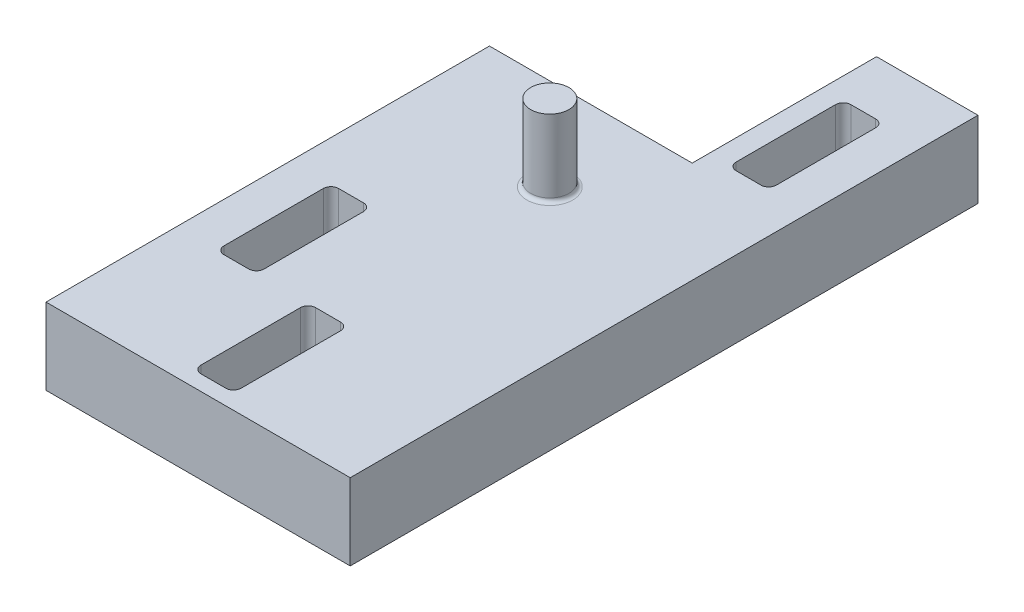
ISO-10303-21;
HEADER;
FILE_DESCRIPTION(('STEP AP214'),'2;1');
FILE_NAME('part.step','',(''),(''),'','','');
FILE_SCHEMA(('AUTOMOTIVE_DESIGN { 1 0 10303 214 1 1 1 1 }'));
ENDSEC;
DATA;
#1=APPLICATION_CONTEXT('core data for automotive mechanical design processes');
#2=APPLICATION_PROTOCOL_DEFINITION('international standard','automotive_design',2000,#1);
#3=PRODUCT_CONTEXT('',#1,'mechanical');
#4=PRODUCT('Part','Part','',(#3));
#5=PRODUCT_RELATED_PRODUCT_CATEGORY('part','',(#4));
#6=PRODUCT_DEFINITION_FORMATION('','',#4);
#7=PRODUCT_DEFINITION_CONTEXT('part definition',#1,'design');
#8=PRODUCT_DEFINITION('design','',#6,#7);
#9=PRODUCT_DEFINITION_SHAPE('','',#8);
#10=(LENGTH_UNIT() NAMED_UNIT(*) SI_UNIT(.MILLI.,.METRE.));
#11=(NAMED_UNIT(*) PLANE_ANGLE_UNIT() SI_UNIT($,.RADIAN.));
#12=(NAMED_UNIT(*) SI_UNIT($,.STERADIAN.) SOLID_ANGLE_UNIT());
#13=UNCERTAINTY_MEASURE_WITH_UNIT(LENGTH_MEASURE(1.E-05),#10,'distance_accuracy_value','');
#14=(GEOMETRIC_REPRESENTATION_CONTEXT(3) GLOBAL_UNCERTAINTY_ASSIGNED_CONTEXT((#13)) GLOBAL_UNIT_ASSIGNED_CONTEXT((#10,
#11,#12)) REPRESENTATION_CONTEXT('',''));
#15=CARTESIAN_POINT('',(0.,0.,0.));
#16=DIRECTION('',(0.,0.,1.));
#17=DIRECTION('',(1.,0.,0.));
#18=AXIS2_PLACEMENT_3D('',#15,#16,#17);
#19=CARTESIAN_POINT('',(0.,10.,0.));
#20=DIRECTION('',(0.,-1.,0.));
#21=DIRECTION('',(0.,0.,-1.));
#22=AXIS2_PLACEMENT_3D('',#19,#20,#21);
#23=PLANE('',#22);
#24=DIRECTION('',(0.,0.,1.));
#25=VECTOR('',#24,1.);
#26=CARTESIAN_POINT('',(-14.625,10.,-17.5));
#27=LINE('',#26,#25);
#28=CARTESIAN_POINT('',(-14.625,10.,-16.5));
#29=VERTEX_POINT('',#28);
#30=CARTESIAN_POINT('',(-14.625,10.,-3.5));
#31=VERTEX_POINT('',#30);
#32=EDGE_CURVE('E551',#29,#31,#27,.T.);
#33=ORIENTED_EDGE('',*,*,#32,.F.);
#34=CARTESIAN_POINT('',(-13.6250000000001,10.,-16.5));
#35=DIRECTION('',(0.,-1.,0.));
#36=DIRECTION('',(0.,0.,-1.));
#37=AXIS2_PLACEMENT_3D('',#34,#35,#36);
#38=CIRCLE('',#37,1.);
#39=CARTESIAN_POINT('',(-13.6250000000001,10.,-17.5));
#40=VERTEX_POINT('',#39);
#41=EDGE_CURVE('E68',#29,#40,#38,.T.);
#42=ORIENTED_EDGE('',*,*,#41,.T.);
#43=DIRECTION('',(-1.,0.,0.));
#44=VECTOR('',#43,1.);
#45=CARTESIAN_POINT('',(-12.,10.,-17.5));
#46=LINE('',#45,#44);
#47=CARTESIAN_POINT('',(-10.375,10.,-17.5));
#48=VERTEX_POINT('',#47);
#49=EDGE_CURVE('E279',#48,#40,#46,.T.);
#50=ORIENTED_EDGE('',*,*,#49,.F.);
#51=CARTESIAN_POINT('',(-10.375,10.,-16.5));
#52=DIRECTION('',(0.,-1.,0.));
#53=DIRECTION('',(0.,0.,-1.));
#54=AXIS2_PLACEMENT_3D('',#51,#52,#53);
#55=CIRCLE('',#54,1.);
#56=CARTESIAN_POINT('',(-9.37500000000007,10.,-16.5));
#57=VERTEX_POINT('',#56);
#58=EDGE_CURVE('E432',#48,#57,#55,.T.);
#59=ORIENTED_EDGE('',*,*,#58,.T.);
#60=DIRECTION('',(0.,0.,-1.));
#61=VECTOR('',#60,1.);
#62=CARTESIAN_POINT('',(-9.37500000000007,10.,-2.5));
#63=LINE('',#62,#61);
#64=CARTESIAN_POINT('',(-9.37500000000007,10.,-3.5));
#65=VERTEX_POINT('',#64);
#66=EDGE_CURVE('E284',#65,#57,#63,.T.);
#67=ORIENTED_EDGE('',*,*,#66,.F.);
#68=CARTESIAN_POINT('',(-10.375,10.,-3.5));
#69=DIRECTION('',(0.,-1.,0.));
#70=DIRECTION('',(0.,0.,-1.));
#71=AXIS2_PLACEMENT_3D('',#68,#69,#70);
#72=CIRCLE('',#71,1.);
#73=CARTESIAN_POINT('',(-10.375,10.,-2.5));
#74=VERTEX_POINT('',#73);
#75=EDGE_CURVE('E428',#65,#74,#72,.T.);
#76=ORIENTED_EDGE('',*,*,#75,.T.);
#77=DIRECTION('',(1.,0.,0.));
#78=VECTOR('',#77,1.);
#79=CARTESIAN_POINT('',(-12.0000000000001,10.,-2.5));
#80=LINE('',#79,#78);
#81=CARTESIAN_POINT('',(-13.6250000000001,10.,-2.5));
#82=VERTEX_POINT('',#81);
#83=EDGE_CURVE('E555',#82,#74,#80,.T.);
#84=ORIENTED_EDGE('',*,*,#83,.F.);
#85=CARTESIAN_POINT('',(-13.6250000000001,10.,-3.5));
#86=DIRECTION('',(0.,-1.,0.));
#87=DIRECTION('',(0.,0.,-1.));
#88=AXIS2_PLACEMENT_3D('',#85,#86,#87);
#89=CIRCLE('',#88,1.);
#90=EDGE_CURVE('E424',#82,#31,#89,.T.);
#91=ORIENTED_EDGE('',*,*,#90,.T.);
#92=EDGE_LOOP('',(#33,#42,#50,#59,#67,#76,#84,#91));
#93=FACE_BOUND('',#92,.T.);
#94=DIRECTION('',(-1.,0.,0.));
#95=VECTOR('',#94,1.);
#96=CARTESIAN_POINT('',(0.,10.,-2.5));
#97=LINE('',#96,#95);
#98=CARTESIAN_POINT('',(1.625,10.,-2.5));
#99=VERTEX_POINT('',#98);
#100=CARTESIAN_POINT('',(-1.62500000000005,10.,-2.5));
#101=VERTEX_POINT('',#100);
#102=EDGE_CURVE('E292',#99,#101,#97,.T.);
#103=ORIENTED_EDGE('',*,*,#102,.F.);
#104=CARTESIAN_POINT('',(1.625,10.,-1.5));
#105=DIRECTION('',(0.,-1.,0.));
#106=DIRECTION('',(0.,0.,-1.));
#107=AXIS2_PLACEMENT_3D('',#104,#105,#106);
#108=CIRCLE('',#107,1.);
#109=CARTESIAN_POINT('',(2.62500000000006,10.,-1.5));
#110=VERTEX_POINT('',#109);
#111=EDGE_CURVE('E354',#99,#110,#108,.T.);
#112=ORIENTED_EDGE('',*,*,#111,.T.);
#113=DIRECTION('',(0.,0.,-1.));
#114=VECTOR('',#113,1.);
#115=CARTESIAN_POINT('',(2.62500000000003,10.,12.5));
#116=LINE('',#115,#114);
#117=CARTESIAN_POINT('',(2.62500000000004,10.,11.5));
#118=VERTEX_POINT('',#117);
#119=EDGE_CURVE('E287',#118,#110,#116,.T.);
#120=ORIENTED_EDGE('',*,*,#119,.F.);
#121=CARTESIAN_POINT('',(1.62499999999998,10.,11.5));
#122=DIRECTION('',(0.,-1.,0.));
#123=DIRECTION('',(0.,0.,-1.));
#124=AXIS2_PLACEMENT_3D('',#121,#122,#123);
#125=CIRCLE('',#124,1.);
#126=CARTESIAN_POINT('',(1.62499999999998,10.,12.5));
#127=VERTEX_POINT('',#126);
#128=EDGE_CURVE('E350',#118,#127,#125,.T.);
#129=ORIENTED_EDGE('',*,*,#128,.T.);
#130=DIRECTION('',(-1.,0.,0.));
#131=VECTOR('',#130,1.);
#132=CARTESIAN_POINT('',(0.,10.,12.5));
#133=LINE('',#132,#131);
#134=CARTESIAN_POINT('',(-1.62500000000006,10.,12.5));
#135=VERTEX_POINT('',#134);
#136=EDGE_CURVE('E298',#127,#135,#133,.T.);
#137=ORIENTED_EDGE('',*,*,#136,.T.);
#138=CARTESIAN_POINT('',(-1.62500000000006,10.,11.5));
#139=DIRECTION('',(0.,-1.,0.));
#140=DIRECTION('',(0.,0.,-1.));
#141=AXIS2_PLACEMENT_3D('',#138,#139,#140);
#142=CIRCLE('',#141,1.);
#143=CARTESIAN_POINT('',(-2.625,10.,11.5));
#144=VERTEX_POINT('',#143);
#145=EDGE_CURVE('E331',#135,#144,#142,.T.);
#146=ORIENTED_EDGE('',*,*,#145,.T.);
#147=DIRECTION('',(0.,0.,1.));
#148=VECTOR('',#147,1.);
#149=CARTESIAN_POINT('',(-2.625,10.,-2.5));
#150=LINE('',#149,#148);
#151=CARTESIAN_POINT('',(-2.625,10.,-1.5));
#152=VERTEX_POINT('',#151);
#153=EDGE_CURVE('E294',#152,#144,#150,.T.);
#154=ORIENTED_EDGE('',*,*,#153,.F.);
#155=CARTESIAN_POINT('',(-1.62500000000005,10.,-1.5));
#156=DIRECTION('',(0.,-1.,0.));
#157=DIRECTION('',(0.,0.,-1.));
#158=AXIS2_PLACEMENT_3D('',#155,#156,#157);
#159=CIRCLE('',#158,1.);
#160=EDGE_CURVE('E335',#152,#101,#159,.T.);
#161=ORIENTED_EDGE('',*,*,#160,.T.);
#162=EDGE_LOOP('',(#103,#112,#120,#129,#137,#146,#154,#161));
#163=FACE_BOUND('',#162,.T.);
#164=DIRECTION('',(-1.,0.,0.));
#165=VECTOR('',#164,1.);
#166=CARTESIAN_POINT('',(11.9999999999999,10.,-60.5));
#167=LINE('',#166,#165);
#168=CARTESIAN_POINT('',(13.6249999999999,10.,-60.5));
#169=VERTEX_POINT('',#168);
#170=CARTESIAN_POINT('',(10.375,10.,-60.5));
#171=VERTEX_POINT('',#170);
#172=EDGE_CURVE('E564',#169,#171,#167,.T.);
#173=ORIENTED_EDGE('',*,*,#172,.F.);
#174=CARTESIAN_POINT('',(13.6249999999999,10.,-59.5));
#175=DIRECTION('',(0.,-1.,0.));
#176=DIRECTION('',(0.,0.,-1.));
#177=AXIS2_PLACEMENT_3D('',#174,#175,#176);
#178=CIRCLE('',#177,1.);
#179=CARTESIAN_POINT('',(14.6249999999999,10.,-59.5));
#180=VERTEX_POINT('',#179);
#181=EDGE_CURVE('E420',#169,#180,#178,.T.);
#182=ORIENTED_EDGE('',*,*,#181,.T.);
#183=DIRECTION('',(0.,0.,-1.));
#184=VECTOR('',#183,1.);
#185=CARTESIAN_POINT('',(14.6249999999999,10.,-60.5));
#186=LINE('',#185,#184);
#187=CARTESIAN_POINT('',(14.6249999999999,10.,-46.5));
#188=VERTEX_POINT('',#187);
#189=EDGE_CURVE('E561',#188,#180,#186,.T.);
#190=ORIENTED_EDGE('',*,*,#189,.F.);
#191=CARTESIAN_POINT('',(13.625,10.,-46.5));
#192=DIRECTION('',(0.,-1.,0.));
#193=DIRECTION('',(0.,0.,-1.));
#194=AXIS2_PLACEMENT_3D('',#191,#192,#193);
#195=CIRCLE('',#194,1.);
#196=CARTESIAN_POINT('',(13.625,10.,-45.5));
#197=VERTEX_POINT('',#196);
#198=EDGE_CURVE('E409',#188,#197,#195,.T.);
#199=ORIENTED_EDGE('',*,*,#198,.T.);
#200=DIRECTION('',(1.,0.,0.));
#201=VECTOR('',#200,1.);
#202=CARTESIAN_POINT('',(12.,10.,-45.5));
#203=LINE('',#202,#201);
#204=CARTESIAN_POINT('',(10.375,10.,-45.5));
#205=VERTEX_POINT('',#204);
#206=EDGE_CURVE('E573',#205,#197,#203,.T.);
#207=ORIENTED_EDGE('',*,*,#206,.F.);
#208=CARTESIAN_POINT('',(10.375,10.,-46.5));
#209=DIRECTION('',(0.,-1.,0.));
#210=DIRECTION('',(0.,0.,-1.));
#211=AXIS2_PLACEMENT_3D('',#208,#209,#210);
#212=CIRCLE('',#211,1.);
#213=CARTESIAN_POINT('',(9.37499999999995,10.,-46.5));
#214=VERTEX_POINT('',#213);
#215=EDGE_CURVE('E405',#205,#214,#212,.T.);
#216=ORIENTED_EDGE('',*,*,#215,.T.);
#217=DIRECTION('',(0.,0.,1.));
#218=VECTOR('',#217,1.);
#219=CARTESIAN_POINT('',(9.37499999999995,10.,-60.5));
#220=LINE('',#219,#218);
#221=CARTESIAN_POINT('',(9.37499999999995,10.,-59.5));
#222=VERTEX_POINT('',#221);
#223=EDGE_CURVE('E569',#222,#214,#220,.T.);
#224=ORIENTED_EDGE('',*,*,#223,.F.);
#225=CARTESIAN_POINT('',(10.375,10.,-59.5));
#226=DIRECTION('',(0.,-1.,0.));
#227=DIRECTION('',(0.,0.,-1.));
#228=AXIS2_PLACEMENT_3D('',#225,#226,#227);
#229=CIRCLE('',#228,1.);
#230=EDGE_CURVE('E414',#222,#171,#229,.T.);
#231=ORIENTED_EDGE('',*,*,#230,.T.);
#232=EDGE_LOOP('',(#173,#182,#190,#199,#207,#216,#224,#231));
#233=FACE_BOUND('',#232,.T.);
#234=CARTESIAN_POINT('',(0.,10.,-31.5));
#235=DIRECTION('',(0.,-1.,0.));
#236=DIRECTION('',(0.,0.,-1.));
#237=AXIS2_PLACEMENT_3D('',#234,#235,#236);
#238=CIRCLE('',#237,3.);
#239=CARTESIAN_POINT('',(0.,10.,-34.5));
#240=VERTEX_POINT('',#239);
#241=EDGE_CURVE('E11',#240,#240,#238,.T.);
#242=ORIENTED_EDGE('',*,*,#241,.T.);
#243=EDGE_LOOP('',(#242));
#244=FACE_BOUND('',#243,.T.);
#245=DIRECTION('',(-1.,0.,0.));
#246=VECTOR('',#245,1.);
#247=CARTESIAN_POINT('',(19.8937990848774,10.,-67.6091923824634));
#248=LINE('',#247,#246);
#249=CARTESIAN_POINT('',(19.8937990848774,10.,-67.6091923824634));
#250=VERTEX_POINT('',#249);
#251=CARTESIAN_POINT('',(6.62379908487737,10.,-67.6091923824634));
#252=VERTEX_POINT('',#251);
#253=EDGE_CURVE('E60',#250,#252,#248,.T.);
#254=ORIENTED_EDGE('',*,*,#253,.T.);
#255=DIRECTION('',(0.,0.,1.));
#256=VECTOR('',#255,1.);
#257=CARTESIAN_POINT('',(6.62379908487737,10.,-67.6091923824634));
#258=LINE('',#257,#256);
#259=CARTESIAN_POINT('',(6.62379908487737,10.,-43.5000000000001));
#260=VERTEX_POINT('',#259);
#261=EDGE_CURVE('E623',#252,#260,#258,.T.);
#262=ORIENTED_EDGE('',*,*,#261,.T.);
#263=DIRECTION('',(-1.,0.,0.));
#264=VECTOR('',#263,1.);
#265=CARTESIAN_POINT('',(-6.62499999999949,10.,-43.5000000000001));
#266=LINE('',#265,#264);
#267=CARTESIAN_POINT('',(-19.8937990848772,10.,-43.5000000000001));
#268=VERTEX_POINT('',#267);
#269=EDGE_CURVE('E272',#260,#268,#266,.T.);
#270=ORIENTED_EDGE('',*,*,#269,.T.);
#271=DIRECTION('',(0.,0.,1.));
#272=VECTOR('',#271,1.);
#273=CARTESIAN_POINT('',(-19.8937990848772,10.,-77.5));
#274=LINE('',#273,#272);
#275=CARTESIAN_POINT('',(-19.8937990848772,10.,14.5));
#276=VERTEX_POINT('',#275);
#277=EDGE_CURVE('E303',#268,#276,#274,.T.);
#278=ORIENTED_EDGE('',*,*,#277,.T.);
#279=DIRECTION('',(1.,0.,0.));
#280=VECTOR('',#279,1.);
#281=CARTESIAN_POINT('',(-19.8937990848772,10.,14.5));
#282=LINE('',#281,#280);
#283=CARTESIAN_POINT('',(19.8937990848772,10.,14.5));
#284=VERTEX_POINT('',#283);
#285=EDGE_CURVE('E300',#276,#284,#282,.T.);
#286=ORIENTED_EDGE('',*,*,#285,.T.);
#287=DIRECTION('',(0.,0.,1.));
#288=VECTOR('',#287,1.);
#289=CARTESIAN_POINT('',(19.8937990848774,10.,-77.5));
#290=LINE('',#289,#288);
#291=EDGE_CURVE('E282',#250,#284,#290,.T.);
#292=ORIENTED_EDGE('',*,*,#291,.F.);
#293=EDGE_LOOP('',(#254,#262,#270,#278,#286,#292));
#294=FACE_BOUND('',#293,.T.);
#295=ADVANCED_FACE('F45',(#93,#163,#233,#244,#294),#23,.F.);
#296=CARTESIAN_POINT('',(0.,0.,0.));
#297=DIRECTION('',(0.,-1.,0.));
#298=DIRECTION('',(0.,0.,-1.));
#299=AXIS2_PLACEMENT_3D('',#296,#297,#298);
#300=PLANE('',#299);
#301=DIRECTION('',(0.,0.,-1.));
#302=VECTOR('',#301,1.);
#303=CARTESIAN_POINT('',(-9.37500000000001,0.,-17.5));
#304=LINE('',#303,#302);
#305=CARTESIAN_POINT('',(-9.37500000000001,0.,-3.5));
#306=VERTEX_POINT('',#305);
#307=CARTESIAN_POINT('',(-9.37500000000001,0.,-16.5));
#308=VERTEX_POINT('',#307);
#309=EDGE_CURVE('E552',#306,#308,#304,.T.);
#310=ORIENTED_EDGE('',*,*,#309,.T.);
#311=CARTESIAN_POINT('',(-10.375,0.,-16.5));
#312=DIRECTION('',(0.,-1.,0.));
#313=DIRECTION('',(0.,0.,-1.));
#314=AXIS2_PLACEMENT_3D('',#311,#312,#313);
#315=CIRCLE('',#314,1.);
#316=CARTESIAN_POINT('',(-10.375,0.,-17.5));
#317=VERTEX_POINT('',#316);
#318=EDGE_CURVE('E430',#308,#317,#315,.F.);
#319=ORIENTED_EDGE('',*,*,#318,.T.);
#320=DIRECTION('',(-1.,0.,0.));
#321=VECTOR('',#320,1.);
#322=CARTESIAN_POINT('',(-12.,0.,-17.5));
#323=LINE('',#322,#321);
#324=CARTESIAN_POINT('',(-13.6250000000001,0.,-17.5));
#325=VERTEX_POINT('',#324);
#326=EDGE_CURVE('E545',#317,#325,#323,.T.);
#327=ORIENTED_EDGE('',*,*,#326,.T.);
#328=CARTESIAN_POINT('',(-13.6250000000001,0.,-16.5));
#329=DIRECTION('',(0.,-1.,0.));
#330=DIRECTION('',(0.,0.,-1.));
#331=AXIS2_PLACEMENT_3D('',#328,#329,#330);
#332=CIRCLE('',#331,1.);
#333=CARTESIAN_POINT('',(-14.6250000000001,0.,-16.5));
#334=VERTEX_POINT('',#333);
#335=EDGE_CURVE('E434',#325,#334,#332,.F.);
#336=ORIENTED_EDGE('',*,*,#335,.T.);
#337=DIRECTION('',(0.,0.,1.));
#338=VECTOR('',#337,1.);
#339=CARTESIAN_POINT('',(-14.6250000000001,0.,-2.5));
#340=LINE('',#339,#338);
#341=CARTESIAN_POINT('',(-14.6250000000001,0.,-3.5));
#342=VERTEX_POINT('',#341);
#343=EDGE_CURVE('E576',#334,#342,#340,.T.);
#344=ORIENTED_EDGE('',*,*,#343,.T.);
#345=CARTESIAN_POINT('',(-13.6250000000001,0.,-3.5));
#346=DIRECTION('',(0.,-1.,0.));
#347=DIRECTION('',(0.,0.,-1.));
#348=AXIS2_PLACEMENT_3D('',#345,#346,#347);
#349=CIRCLE('',#348,1.);
#350=CARTESIAN_POINT('',(-13.6250000000001,0.,-2.5));
#351=VERTEX_POINT('',#350);
#352=EDGE_CURVE('E422',#342,#351,#349,.F.);
#353=ORIENTED_EDGE('',*,*,#352,.T.);
#354=DIRECTION('',(1.,0.,0.));
#355=VECTOR('',#354,1.);
#356=CARTESIAN_POINT('',(-12.0000000000001,0.,-2.5));
#357=LINE('',#356,#355);
#358=CARTESIAN_POINT('',(-10.375,0.,-2.5));
#359=VERTEX_POINT('',#358);
#360=EDGE_CURVE('E557',#351,#359,#357,.T.);
#361=ORIENTED_EDGE('',*,*,#360,.T.);
#362=CARTESIAN_POINT('',(-10.375,0.,-3.5));
#363=DIRECTION('',(0.,-1.,0.));
#364=DIRECTION('',(0.,0.,-1.));
#365=AXIS2_PLACEMENT_3D('',#362,#363,#364);
#366=CIRCLE('',#365,1.);
#367=EDGE_CURVE('E426',#359,#306,#366,.F.);
#368=ORIENTED_EDGE('',*,*,#367,.T.);
#369=EDGE_LOOP('',(#310,#319,#327,#336,#344,#353,#361,#368));
#370=FACE_BOUND('',#369,.T.);
#371=DIRECTION('',(1.,0.,0.));
#372=VECTOR('',#371,1.);
#373=CARTESIAN_POINT('',(12.,0.,-45.5));
#374=LINE('',#373,#372);
#375=CARTESIAN_POINT('',(10.375,0.,-45.5));
#376=VERTEX_POINT('',#375);
#377=CARTESIAN_POINT('',(13.625,0.,-45.5));
#378=VERTEX_POINT('',#377);
#379=EDGE_CURVE('E585',#376,#378,#374,.T.);
#380=ORIENTED_EDGE('',*,*,#379,.T.);
#381=CARTESIAN_POINT('',(13.625,0.,-46.5));
#382=DIRECTION('',(0.,-1.,0.));
#383=DIRECTION('',(0.,0.,-1.));
#384=AXIS2_PLACEMENT_3D('',#381,#382,#383);
#385=CIRCLE('',#384,1.);
#386=CARTESIAN_POINT('',(14.625,0.,-46.5));
#387=VERTEX_POINT('',#386);
#388=EDGE_CURVE('E407',#378,#387,#385,.F.);
#389=ORIENTED_EDGE('',*,*,#388,.T.);
#390=DIRECTION('',(0.,0.,-1.));
#391=VECTOR('',#390,1.);
#392=CARTESIAN_POINT('',(14.6249999999999,0.,-58.));
#393=LINE('',#392,#391);
#394=CARTESIAN_POINT('',(14.6249999999999,0.,-59.5));
#395=VERTEX_POINT('',#394);
#396=EDGE_CURVE('E565',#387,#395,#393,.T.);
#397=ORIENTED_EDGE('',*,*,#396,.T.);
#398=CARTESIAN_POINT('',(13.6249999999999,0.,-59.5));
#399=DIRECTION('',(0.,-1.,0.));
#400=DIRECTION('',(0.,0.,-1.));
#401=AXIS2_PLACEMENT_3D('',#398,#399,#400);
#402=CIRCLE('',#401,1.);
#403=CARTESIAN_POINT('',(13.6249999999999,0.,-60.5));
#404=VERTEX_POINT('',#403);
#405=EDGE_CURVE('E417',#395,#404,#402,.F.);
#406=ORIENTED_EDGE('',*,*,#405,.T.);
#407=DIRECTION('',(-1.,0.,0.));
#408=VECTOR('',#407,1.);
#409=CARTESIAN_POINT('',(11.9999999999999,0.,-60.5));
#410=LINE('',#409,#408);
#411=CARTESIAN_POINT('',(10.375,0.,-60.5));
#412=VERTEX_POINT('',#411);
#413=EDGE_CURVE('E577',#404,#412,#410,.T.);
#414=ORIENTED_EDGE('',*,*,#413,.T.);
#415=CARTESIAN_POINT('',(10.375,0.,-59.5));
#416=DIRECTION('',(0.,-1.,0.));
#417=DIRECTION('',(0.,0.,-1.));
#418=AXIS2_PLACEMENT_3D('',#415,#416,#417);
#419=CIRCLE('',#418,1.);
#420=CARTESIAN_POINT('',(9.37500000000001,0.,-59.5));
#421=VERTEX_POINT('',#420);
#422=EDGE_CURVE('E411',#412,#421,#419,.F.);
#423=ORIENTED_EDGE('',*,*,#422,.T.);
#424=DIRECTION('',(0.,0.,1.));
#425=VECTOR('',#424,1.);
#426=CARTESIAN_POINT('',(9.37500000000001,0.,-45.5));
#427=LINE('',#426,#425);
#428=CARTESIAN_POINT('',(9.37500000000001,0.,-46.5));
#429=VERTEX_POINT('',#428);
#430=EDGE_CURVE('E581',#421,#429,#427,.T.);
#431=ORIENTED_EDGE('',*,*,#430,.T.);
#432=CARTESIAN_POINT('',(10.375,0.,-46.5));
#433=DIRECTION('',(0.,-1.,0.));
#434=DIRECTION('',(0.,0.,-1.));
#435=AXIS2_PLACEMENT_3D('',#432,#433,#434);
#436=CIRCLE('',#435,1.);
#437=EDGE_CURVE('E402',#429,#376,#436,.F.);
#438=ORIENTED_EDGE('',*,*,#437,.T.);
#439=EDGE_LOOP('',(#380,#389,#397,#406,#414,#423,#431,#438));
#440=FACE_BOUND('',#439,.T.);
#441=DIRECTION('',(0.,0.,1.));
#442=VECTOR('',#441,1.);
#443=CARTESIAN_POINT('',(2.625,0.,-2.5));
#444=LINE('',#443,#442);
#445=CARTESIAN_POINT('',(2.625,0.,-1.5));
#446=VERTEX_POINT('',#445);
#447=CARTESIAN_POINT('',(2.62499999999998,0.,11.5));
#448=VERTEX_POINT('',#447);
#449=EDGE_CURVE('E278',#446,#448,#444,.T.);
#450=ORIENTED_EDGE('',*,*,#449,.F.);
#451=CARTESIAN_POINT('',(1.625,0.,-1.5));
#452=DIRECTION('',(0.,-1.,0.));
#453=DIRECTION('',(0.,0.,-1.));
#454=AXIS2_PLACEMENT_3D('',#451,#452,#453);
#455=CIRCLE('',#454,1.);
#456=CARTESIAN_POINT('',(1.625,0.,-2.5));
#457=VERTEX_POINT('',#456);
#458=EDGE_CURVE('E352',#446,#457,#455,.F.);
#459=ORIENTED_EDGE('',*,*,#458,.T.);
#460=DIRECTION('',(-1.,0.,0.));
#461=VECTOR('',#460,1.);
#462=CARTESIAN_POINT('',(0.,0.,-2.5));
#463=LINE('',#462,#461);
#464=CARTESIAN_POINT('',(-1.62500000000005,0.,-2.5));
#465=VERTEX_POINT('',#464);
#466=EDGE_CURVE('E291',#457,#465,#463,.T.);
#467=ORIENTED_EDGE('',*,*,#466,.T.);
#468=CARTESIAN_POINT('',(-1.62500000000005,0.,-1.5));
#469=DIRECTION('',(0.,-1.,0.));
#470=DIRECTION('',(0.,0.,-1.));
#471=AXIS2_PLACEMENT_3D('',#468,#469,#470);
#472=CIRCLE('',#471,1.);
#473=CARTESIAN_POINT('',(-2.62500000000005,0.,-1.5));
#474=VERTEX_POINT('',#473);
#475=EDGE_CURVE('E333',#465,#474,#472,.F.);
#476=ORIENTED_EDGE('',*,*,#475,.T.);
#477=DIRECTION('',(0.,0.,-1.));
#478=VECTOR('',#477,1.);
#479=CARTESIAN_POINT('',(-2.62500000000006,0.,12.5));
#480=LINE('',#479,#478);
#481=CARTESIAN_POINT('',(-2.62500000000006,0.,11.5));
#482=VERTEX_POINT('',#481);
#483=EDGE_CURVE('E307',#482,#474,#480,.T.);
#484=ORIENTED_EDGE('',*,*,#483,.F.);
#485=CARTESIAN_POINT('',(-1.62500000000006,0.,11.5));
#486=DIRECTION('',(0.,-1.,0.));
#487=DIRECTION('',(0.,0.,-1.));
#488=AXIS2_PLACEMENT_3D('',#485,#486,#487);
#489=CIRCLE('',#488,1.);
#490=CARTESIAN_POINT('',(-1.62500000000006,0.,12.5));
#491=VERTEX_POINT('',#490);
#492=EDGE_CURVE('E328',#482,#491,#489,.F.);
#493=ORIENTED_EDGE('',*,*,#492,.T.);
#494=DIRECTION('',(-1.,0.,0.));
#495=VECTOR('',#494,1.);
#496=CARTESIAN_POINT('',(0.,0.,12.5));
#497=LINE('',#496,#495);
#498=CARTESIAN_POINT('',(1.62499999999998,0.,12.5));
#499=VERTEX_POINT('',#498);
#500=EDGE_CURVE('E310',#499,#491,#497,.T.);
#501=ORIENTED_EDGE('',*,*,#500,.F.);
#502=CARTESIAN_POINT('',(1.62499999999998,0.,11.5));
#503=DIRECTION('',(0.,-1.,0.));
#504=DIRECTION('',(0.,0.,-1.));
#505=AXIS2_PLACEMENT_3D('',#502,#503,#504);
#506=CIRCLE('',#505,1.);
#507=EDGE_CURVE('E348',#499,#448,#506,.F.);
#508=ORIENTED_EDGE('',*,*,#507,.T.);
#509=EDGE_LOOP('',(#450,#459,#467,#476,#484,#493,#501,#508));
#510=FACE_BOUND('',#509,.T.);
#511=DIRECTION('',(0.,0.,1.));
#512=VECTOR('',#511,1.);
#513=CARTESIAN_POINT('',(6.62379908487737,0.,-67.6091923824634));
#514=LINE('',#513,#512);
#515=CARTESIAN_POINT('',(6.62379908487737,0.,-67.6091923824634));
#516=VERTEX_POINT('',#515);
#517=CARTESIAN_POINT('',(6.62379908487737,0.,-43.5000000000001));
#518=VERTEX_POINT('',#517);
#519=EDGE_CURVE('E270',#516,#518,#514,.T.);
#520=ORIENTED_EDGE('',*,*,#519,.F.);
#521=DIRECTION('',(-1.,0.,0.));
#522=VECTOR('',#521,1.);
#523=CARTESIAN_POINT('',(19.8937990848774,0.,-67.6091923824634));
#524=LINE('',#523,#522);
#525=CARTESIAN_POINT('',(19.8937990848774,0.,-67.6091923824634));
#526=VERTEX_POINT('',#525);
#527=EDGE_CURVE('E255',#526,#516,#524,.T.);
#528=ORIENTED_EDGE('',*,*,#527,.F.);
#529=DIRECTION('',(0.,0.,1.));
#530=VECTOR('',#529,1.);
#531=CARTESIAN_POINT('',(19.8937990848774,0.,-77.5));
#532=LINE('',#531,#530);
#533=CARTESIAN_POINT('',(19.8937990848772,0.,14.5));
#534=VERTEX_POINT('',#533);
#535=EDGE_CURVE('E267',#526,#534,#532,.T.);
#536=ORIENTED_EDGE('',*,*,#535,.T.);
#537=DIRECTION('',(1.,0.,0.));
#538=VECTOR('',#537,1.);
#539=CARTESIAN_POINT('',(-19.8937990848772,0.,14.5));
#540=LINE('',#539,#538);
#541=CARTESIAN_POINT('',(-19.8937990848772,0.,14.5));
#542=VERTEX_POINT('',#541);
#543=EDGE_CURVE('E312',#542,#534,#540,.T.);
#544=ORIENTED_EDGE('',*,*,#543,.F.);
#545=DIRECTION('',(0.,0.,1.));
#546=VECTOR('',#545,1.);
#547=CARTESIAN_POINT('',(-19.8937990848772,0.,-77.5));
#548=LINE('',#547,#546);
#549=CARTESIAN_POINT('',(-19.8937990848772,0.,-43.5000000000001));
#550=VERTEX_POINT('',#549);
#551=EDGE_CURVE('E295',#550,#542,#548,.T.);
#552=ORIENTED_EDGE('',*,*,#551,.F.);
#553=DIRECTION('',(-1.,0.,0.));
#554=VECTOR('',#553,1.);
#555=CARTESIAN_POINT('',(6.62379908487737,0.,-43.5000000000001));
#556=LINE('',#555,#554);
#557=EDGE_CURVE('E629',#518,#550,#556,.T.);
#558=ORIENTED_EDGE('',*,*,#557,.F.);
#559=EDGE_LOOP('',(#520,#528,#536,#544,#552,#558));
#560=FACE_BOUND('',#559,.T.);
#561=ADVANCED_FACE('F265',(#370,#440,#510,#560),#300,.T.);
#562=CARTESIAN_POINT('',(-19.8937990848772,10.,-77.5));
#563=DIRECTION('',(1.,0.,0.));
#564=DIRECTION('',(0.,0.,-1.));
#565=AXIS2_PLACEMENT_3D('',#562,#563,#564);
#566=PLANE('',#565);
#567=DIRECTION('',(0.,1.,0.));
#568=VECTOR('',#567,1.);
#569=CARTESIAN_POINT('',(-19.8937990848772,0.,-43.5000000000001));
#570=LINE('',#569,#568);
#571=EDGE_CURVE('E633',#550,#268,#570,.T.);
#572=ORIENTED_EDGE('',*,*,#571,.F.);
#573=ORIENTED_EDGE('',*,*,#551,.T.);
#574=DIRECTION('',(0.,-1.,0.));
#575=VECTOR('',#574,1.);
#576=CARTESIAN_POINT('',(-19.8937990848772,10.,14.5));
#577=LINE('',#576,#575);
#578=EDGE_CURVE('E305',#276,#542,#577,.T.);
#579=ORIENTED_EDGE('',*,*,#578,.F.);
#580=ORIENTED_EDGE('',*,*,#277,.F.);
#581=EDGE_LOOP('',(#572,#573,#579,#580));
#582=FACE_BOUND('',#581,.T.);
#583=ADVANCED_FACE('F461',(#582),#566,.F.);
#584=CARTESIAN_POINT('',(19.8937990848774,10.,-77.5));
#585=DIRECTION('',(1.,0.,0.));
#586=DIRECTION('',(0.,0.,-1.));
#587=AXIS2_PLACEMENT_3D('',#584,#585,#586);
#588=PLANE('',#587);
#589=ORIENTED_EDGE('',*,*,#535,.F.);
#590=DIRECTION('',(0.,1.,0.));
#591=VECTOR('',#590,1.);
#592=CARTESIAN_POINT('',(19.8937990848774,0.,-67.6091923824634));
#593=LINE('',#592,#591);
#594=EDGE_CURVE('E252',#526,#250,#593,.T.);
#595=ORIENTED_EDGE('',*,*,#594,.T.);
#596=ORIENTED_EDGE('',*,*,#291,.T.);
#597=DIRECTION('',(0.,-1.,0.));
#598=VECTOR('',#597,1.);
#599=CARTESIAN_POINT('',(19.8937990848772,10.,14.5));
#600=LINE('',#599,#598);
#601=EDGE_CURVE('E277',#284,#534,#600,.T.);
#602=ORIENTED_EDGE('',*,*,#601,.T.);
#603=EDGE_LOOP('',(#589,#595,#596,#602));
#604=FACE_BOUND('',#603,.T.);
#605=ADVANCED_FACE('F275',(#604),#588,.T.);
#606=CARTESIAN_POINT('',(-19.8937990848772,10.,14.5));
#607=DIRECTION('',(0.,0.,-1.));
#608=DIRECTION('',(-1.,0.,0.));
#609=AXIS2_PLACEMENT_3D('',#606,#607,#608);
#610=PLANE('',#609);
#611=ORIENTED_EDGE('',*,*,#543,.T.);
#612=ORIENTED_EDGE('',*,*,#601,.F.);
#613=ORIENTED_EDGE('',*,*,#285,.F.);
#614=ORIENTED_EDGE('',*,*,#578,.T.);
#615=EDGE_LOOP('',(#611,#612,#613,#614));
#616=FACE_BOUND('',#615,.T.);
#617=ADVANCED_FACE('F471',(#616),#610,.F.);
#618=CARTESIAN_POINT('',(0.,10.,12.5));
#619=DIRECTION('',(0.,0.,1.));
#620=DIRECTION('',(1.,0.,0.));
#621=AXIS2_PLACEMENT_3D('',#618,#619,#620);
#622=PLANE('',#621);
#623=ORIENTED_EDGE('',*,*,#136,.F.);
#624=DIRECTION('',(0.,-1.,0.));
#625=VECTOR('',#624,1.);
#626=CARTESIAN_POINT('',(1.62499999999998,0.,12.5));
#627=LINE('',#626,#625);
#628=EDGE_CURVE('E338',#127,#499,#627,.T.);
#629=ORIENTED_EDGE('',*,*,#628,.T.);
#630=ORIENTED_EDGE('',*,*,#500,.T.);
#631=DIRECTION('',(0.,-1.,0.));
#632=VECTOR('',#631,1.);
#633=CARTESIAN_POINT('',(-1.62500000000006,10.,12.5));
#634=LINE('',#633,#632);
#635=EDGE_CURVE('E322',#491,#135,#634,.F.);
#636=ORIENTED_EDGE('',*,*,#635,.T.);
#637=EDGE_LOOP('',(#623,#629,#630,#636));
#638=FACE_BOUND('',#637,.T.);
#639=ADVANCED_FACE('F474',(#638),#622,.F.);
#640=CARTESIAN_POINT('',(-2.62500000000006,10.,12.5));
#641=DIRECTION('',(-1.,0.,0.));
#642=DIRECTION('',(0.,0.,1.));
#643=AXIS2_PLACEMENT_3D('',#640,#641,#642);
#644=PLANE('',#643);
#645=ORIENTED_EDGE('',*,*,#153,.T.);
#646=DIRECTION('',(0.,-1.,0.));
#647=VECTOR('',#646,1.);
#648=CARTESIAN_POINT('',(-2.62500000000006,0.,11.5));
#649=LINE('',#648,#647);
#650=EDGE_CURVE('E319',#144,#482,#649,.T.);
#651=ORIENTED_EDGE('',*,*,#650,.T.);
#652=ORIENTED_EDGE('',*,*,#483,.T.);
#653=DIRECTION('',(0.,-1.,0.));
#654=VECTOR('',#653,1.);
#655=CARTESIAN_POINT('',(-2.62500000000005,10.,-1.5));
#656=LINE('',#655,#654);
#657=EDGE_CURVE('E317',#474,#152,#656,.F.);
#658=ORIENTED_EDGE('',*,*,#657,.T.);
#659=EDGE_LOOP('',(#645,#651,#652,#658));
#660=FACE_BOUND('',#659,.T.);
#661=ADVANCED_FACE('F478',(#660),#644,.F.);
#662=CARTESIAN_POINT('',(0.,10.,-2.5));
#663=DIRECTION('',(0.,0.,1.));
#664=DIRECTION('',(1.,0.,0.));
#665=AXIS2_PLACEMENT_3D('',#662,#663,#664);
#666=PLANE('',#665);
#667=ORIENTED_EDGE('',*,*,#466,.F.);
#668=DIRECTION('',(0.,-1.,0.));
#669=VECTOR('',#668,1.);
#670=CARTESIAN_POINT('',(1.625,10.,-2.5));
#671=LINE('',#670,#669);
#672=EDGE_CURVE('E346',#457,#99,#671,.F.);
#673=ORIENTED_EDGE('',*,*,#672,.T.);
#674=ORIENTED_EDGE('',*,*,#102,.T.);
#675=DIRECTION('',(0.,-1.,0.));
#676=VECTOR('',#675,1.);
#677=CARTESIAN_POINT('',(-1.62500000000005,10.,-2.5));
#678=LINE('',#677,#676);
#679=EDGE_CURVE('E325',#101,#465,#678,.T.);
#680=ORIENTED_EDGE('',*,*,#679,.T.);
#681=EDGE_LOOP('',(#667,#673,#674,#680));
#682=FACE_BOUND('',#681,.T.);
#683=ADVANCED_FACE('F482',(#682),#666,.T.);
#684=CARTESIAN_POINT('',(-1.62500000000006,10.,11.5));
#685=DIRECTION('',(0.,1.,0.));
#686=DIRECTION('',(0.,0.,1.));
#687=AXIS2_PLACEMENT_3D('',#684,#685,#686);
#688=CYLINDRICAL_SURFACE('',#687,1.);
#689=ORIENTED_EDGE('',*,*,#145,.F.);
#690=ORIENTED_EDGE('',*,*,#635,.F.);
#691=ORIENTED_EDGE('',*,*,#492,.F.);
#692=ORIENTED_EDGE('',*,*,#650,.F.);
#693=EDGE_LOOP('',(#689,#690,#691,#692));
#694=FACE_BOUND('',#693,.T.);
#695=ADVANCED_FACE('F486',(#694),#688,.F.);
#696=CARTESIAN_POINT('',(-1.62500000000005,10.,-1.5));
#697=DIRECTION('',(0.,-1.,0.));
#698=DIRECTION('',(0.,0.,-1.));
#699=AXIS2_PLACEMENT_3D('',#696,#697,#698);
#700=CYLINDRICAL_SURFACE('',#699,1.);
#701=ORIENTED_EDGE('',*,*,#160,.F.);
#702=ORIENTED_EDGE('',*,*,#657,.F.);
#703=ORIENTED_EDGE('',*,*,#475,.F.);
#704=ORIENTED_EDGE('',*,*,#679,.F.);
#705=EDGE_LOOP('',(#701,#702,#703,#704));
#706=FACE_BOUND('',#705,.T.);
#707=ADVANCED_FACE('F490',(#706),#700,.F.);
#708=CARTESIAN_POINT('',(2.625,10.,-2.5));
#709=DIRECTION('',(1.,0.,0.));
#710=DIRECTION('',(0.,0.,-1.));
#711=AXIS2_PLACEMENT_3D('',#708,#709,#710);
#712=PLANE('',#711);
#713=ORIENTED_EDGE('',*,*,#449,.T.);
#714=DIRECTION('',(0.,-1.,0.));
#715=VECTOR('',#714,1.);
#716=CARTESIAN_POINT('',(2.62499999999998,10.,11.5));
#717=LINE('',#716,#715);
#718=EDGE_CURVE('E344',#448,#118,#717,.F.);
#719=ORIENTED_EDGE('',*,*,#718,.T.);
#720=ORIENTED_EDGE('',*,*,#119,.T.);
#721=DIRECTION('',(0.,-1.,0.));
#722=VECTOR('',#721,1.);
#723=CARTESIAN_POINT('',(2.625,10.,-1.5));
#724=LINE('',#723,#722);
#725=EDGE_CURVE('E341',#110,#446,#724,.T.);
#726=ORIENTED_EDGE('',*,*,#725,.T.);
#727=EDGE_LOOP('',(#713,#719,#720,#726));
#728=FACE_BOUND('',#727,.T.);
#729=ADVANCED_FACE('F494',(#728),#712,.F.);
#730=CARTESIAN_POINT('',(1.62499999999998,10.,11.5));
#731=DIRECTION('',(0.,1.,0.));
#732=DIRECTION('',(0.,0.,1.));
#733=AXIS2_PLACEMENT_3D('',#730,#731,#732);
#734=CYLINDRICAL_SURFACE('',#733,1.);
#735=ORIENTED_EDGE('',*,*,#128,.F.);
#736=ORIENTED_EDGE('',*,*,#718,.F.);
#737=ORIENTED_EDGE('',*,*,#507,.F.);
#738=ORIENTED_EDGE('',*,*,#628,.F.);
#739=EDGE_LOOP('',(#735,#736,#737,#738));
#740=FACE_BOUND('',#739,.T.);
#741=ADVANCED_FACE('F496',(#740),#734,.F.);
#742=CARTESIAN_POINT('',(1.625,10.,-1.5));
#743=DIRECTION('',(0.,-1.,0.));
#744=DIRECTION('',(0.,0.,-1.));
#745=AXIS2_PLACEMENT_3D('',#742,#743,#744);
#746=CYLINDRICAL_SURFACE('',#745,1.);
#747=ORIENTED_EDGE('',*,*,#111,.F.);
#748=ORIENTED_EDGE('',*,*,#672,.F.);
#749=ORIENTED_EDGE('',*,*,#458,.F.);
#750=ORIENTED_EDGE('',*,*,#725,.F.);
#751=EDGE_LOOP('',(#747,#748,#749,#750));
#752=FACE_BOUND('',#751,.T.);
#753=ADVANCED_FACE('F499',(#752),#746,.F.);
#754=CARTESIAN_POINT('',(11.9999999999999,10.,-60.5));
#755=DIRECTION('',(0.,0.,1.));
#756=DIRECTION('',(1.,0.,0.));
#757=AXIS2_PLACEMENT_3D('',#754,#755,#756);
#758=PLANE('',#757);
#759=ORIENTED_EDGE('',*,*,#172,.T.);
#760=DIRECTION('',(0.,-1.,0.));
#761=VECTOR('',#760,1.);
#762=CARTESIAN_POINT('',(10.375,0.,-60.5));
#763=LINE('',#762,#761);
#764=EDGE_CURVE('E378',#171,#412,#763,.T.);
#765=ORIENTED_EDGE('',*,*,#764,.T.);
#766=ORIENTED_EDGE('',*,*,#413,.F.);
#767=DIRECTION('',(0.,-1.,0.));
#768=VECTOR('',#767,1.);
#769=CARTESIAN_POINT('',(13.6249999999999,10.,-60.5));
#770=LINE('',#769,#768);
#771=EDGE_CURVE('E375',#404,#169,#770,.F.);
#772=ORIENTED_EDGE('',*,*,#771,.T.);
#773=EDGE_LOOP('',(#759,#765,#766,#772));
#774=FACE_BOUND('',#773,.T.);
#775=ADVANCED_FACE('F503',(#774),#758,.T.);
#776=CARTESIAN_POINT('',(9.37500000000001,10.,-45.5));
#777=DIRECTION('',(1.,0.,0.));
#778=DIRECTION('',(0.,0.,-1.));
#779=AXIS2_PLACEMENT_3D('',#776,#777,#778);
#780=PLANE('',#779);
#781=ORIENTED_EDGE('',*,*,#223,.T.);
#782=DIRECTION('',(0.,-1.,0.));
#783=VECTOR('',#782,1.);
#784=CARTESIAN_POINT('',(9.37500000000001,0.,-46.5));
#785=LINE('',#784,#783);
#786=EDGE_CURVE('E359',#214,#429,#785,.T.);
#787=ORIENTED_EDGE('',*,*,#786,.T.);
#788=ORIENTED_EDGE('',*,*,#430,.F.);
#789=DIRECTION('',(0.,-1.,0.));
#790=VECTOR('',#789,1.);
#791=CARTESIAN_POINT('',(9.37500000000001,10.,-59.5));
#792=LINE('',#791,#790);
#793=EDGE_CURVE('E356',#421,#222,#792,.F.);
#794=ORIENTED_EDGE('',*,*,#793,.T.);
#795=EDGE_LOOP('',(#781,#787,#788,#794));
#796=FACE_BOUND('',#795,.T.);
#797=ADVANCED_FACE('F675',(#796),#780,.T.);
#798=CARTESIAN_POINT('',(12.,10.,-45.5));
#799=DIRECTION('',(0.,0.,-1.));
#800=DIRECTION('',(-1.,0.,0.));
#801=AXIS2_PLACEMENT_3D('',#798,#799,#800);
#802=PLANE('',#801);
#803=ORIENTED_EDGE('',*,*,#379,.F.);
#804=DIRECTION('',(0.,-1.,0.));
#805=VECTOR('',#804,1.);
#806=CARTESIAN_POINT('',(10.375,10.,-45.5));
#807=LINE('',#806,#805);
#808=EDGE_CURVE('E366',#376,#205,#807,.F.);
#809=ORIENTED_EDGE('',*,*,#808,.T.);
#810=ORIENTED_EDGE('',*,*,#206,.T.);
#811=DIRECTION('',(0.,-1.,0.));
#812=VECTOR('',#811,1.);
#813=CARTESIAN_POINT('',(13.625,0.,-45.5));
#814=LINE('',#813,#812);
#815=EDGE_CURVE('E363',#197,#378,#814,.T.);
#816=ORIENTED_EDGE('',*,*,#815,.T.);
#817=EDGE_LOOP('',(#803,#809,#810,#816));
#818=FACE_BOUND('',#817,.T.);
#819=ADVANCED_FACE('F668',(#818),#802,.T.);
#820=CARTESIAN_POINT('',(14.6249999999999,10.,-58.));
#821=DIRECTION('',(-1.,0.,0.));
#822=DIRECTION('',(0.,0.,1.));
#823=AXIS2_PLACEMENT_3D('',#820,#821,#822);
#824=PLANE('',#823);
#825=ORIENTED_EDGE('',*,*,#396,.F.);
#826=DIRECTION('',(0.,-1.,0.));
#827=VECTOR('',#826,1.);
#828=CARTESIAN_POINT('',(14.625,10.,-46.5));
#829=LINE('',#828,#827);
#830=EDGE_CURVE('E373',#387,#188,#829,.F.);
#831=ORIENTED_EDGE('',*,*,#830,.T.);
#832=ORIENTED_EDGE('',*,*,#189,.T.);
#833=DIRECTION('',(0.,-1.,0.));
#834=VECTOR('',#833,1.);
#835=CARTESIAN_POINT('',(14.6249999999999,0.,-59.5));
#836=LINE('',#835,#834);
#837=EDGE_CURVE('E369',#180,#395,#836,.T.);
#838=ORIENTED_EDGE('',*,*,#837,.T.);
#839=EDGE_LOOP('',(#825,#831,#832,#838));
#840=FACE_BOUND('',#839,.T.);
#841=ADVANCED_FACE('F660',(#840),#824,.T.);
#842=CARTESIAN_POINT('',(-14.6250000000001,10.,-2.5));
#843=DIRECTION('',(1.,0.,0.));
#844=DIRECTION('',(0.,0.,-1.));
#845=AXIS2_PLACEMENT_3D('',#842,#843,#844);
#846=PLANE('',#845);
#847=ORIENTED_EDGE('',*,*,#32,.T.);
#848=DIRECTION('',(0.,-1.,0.));
#849=VECTOR('',#848,1.);
#850=CARTESIAN_POINT('',(-14.6250000000001,0.,-3.5));
#851=LINE('',#850,#849);
#852=EDGE_CURVE('E384',#31,#342,#851,.T.);
#853=ORIENTED_EDGE('',*,*,#852,.T.);
#854=ORIENTED_EDGE('',*,*,#343,.F.);
#855=DIRECTION('',(0.,-1.,0.));
#856=VECTOR('',#855,1.);
#857=CARTESIAN_POINT('',(-14.6250000000001,10.,-16.5));
#858=LINE('',#857,#856);
#859=EDGE_CURVE('E382',#334,#29,#858,.F.);
#860=ORIENTED_EDGE('',*,*,#859,.T.);
#861=EDGE_LOOP('',(#847,#853,#854,#860));
#862=FACE_BOUND('',#861,.T.);
#863=ADVANCED_FACE('F658',(#862),#846,.T.);
#864=CARTESIAN_POINT('',(-12.0000000000001,10.,-2.5));
#865=DIRECTION('',(0.,0.,-1.));
#866=DIRECTION('',(-1.,0.,0.));
#867=AXIS2_PLACEMENT_3D('',#864,#865,#866);
#868=PLANE('',#867);
#869=ORIENTED_EDGE('',*,*,#360,.F.);
#870=DIRECTION('',(0.,-1.,0.));
#871=VECTOR('',#870,1.);
#872=CARTESIAN_POINT('',(-13.6250000000001,10.,-2.5));
#873=LINE('',#872,#871);
#874=EDGE_CURVE('E390',#351,#82,#873,.F.);
#875=ORIENTED_EDGE('',*,*,#874,.T.);
#876=ORIENTED_EDGE('',*,*,#83,.T.);
#877=DIRECTION('',(0.,-1.,0.));
#878=VECTOR('',#877,1.);
#879=CARTESIAN_POINT('',(-10.375,0.,-2.5));
#880=LINE('',#879,#878);
#881=EDGE_CURVE('E387',#74,#359,#880,.T.);
#882=ORIENTED_EDGE('',*,*,#881,.T.);
#883=EDGE_LOOP('',(#869,#875,#876,#882));
#884=FACE_BOUND('',#883,.T.);
#885=ADVANCED_FACE('F652',(#884),#868,.T.);
#886=CARTESIAN_POINT('',(-9.37500000000001,10.,-17.5));
#887=DIRECTION('',(-1.,0.,0.));
#888=DIRECTION('',(0.,0.,1.));
#889=AXIS2_PLACEMENT_3D('',#886,#887,#888);
#890=PLANE('',#889);
#891=ORIENTED_EDGE('',*,*,#309,.F.);
#892=DIRECTION('',(0.,-1.,0.));
#893=VECTOR('',#892,1.);
#894=CARTESIAN_POINT('',(-9.37500000000001,10.,-3.5));
#895=LINE('',#894,#893);
#896=EDGE_CURVE('E395',#306,#65,#895,.F.);
#897=ORIENTED_EDGE('',*,*,#896,.T.);
#898=ORIENTED_EDGE('',*,*,#66,.T.);
#899=DIRECTION('',(0.,-1.,0.));
#900=VECTOR('',#899,1.);
#901=CARTESIAN_POINT('',(-9.37500000000001,0.,-16.5));
#902=LINE('',#901,#900);
#903=EDGE_CURVE('E392',#57,#308,#902,.T.);
#904=ORIENTED_EDGE('',*,*,#903,.T.);
#905=EDGE_LOOP('',(#891,#897,#898,#904));
#906=FACE_BOUND('',#905,.T.);
#907=ADVANCED_FACE('F666',(#906),#890,.T.);
#908=CARTESIAN_POINT('',(-12.,10.,-17.5));
#909=DIRECTION('',(0.,0.,1.));
#910=DIRECTION('',(1.,0.,0.));
#911=AXIS2_PLACEMENT_3D('',#908,#909,#910);
#912=PLANE('',#911);
#913=ORIENTED_EDGE('',*,*,#326,.F.);
#914=DIRECTION('',(0.,-1.,0.));
#915=VECTOR('',#914,1.);
#916=CARTESIAN_POINT('',(-10.375,10.,-17.5));
#917=LINE('',#916,#915);
#918=EDGE_CURVE('E400',#317,#48,#917,.F.);
#919=ORIENTED_EDGE('',*,*,#918,.T.);
#920=ORIENTED_EDGE('',*,*,#49,.T.);
#921=DIRECTION('',(0.,-1.,0.));
#922=VECTOR('',#921,1.);
#923=CARTESIAN_POINT('',(-13.6250000000001,0.,-17.5));
#924=LINE('',#923,#922);
#925=EDGE_CURVE('E397',#40,#325,#924,.T.);
#926=ORIENTED_EDGE('',*,*,#925,.T.);
#927=EDGE_LOOP('',(#913,#919,#920,#926));
#928=FACE_BOUND('',#927,.T.);
#929=ADVANCED_FACE('F509',(#928),#912,.T.);
#930=CARTESIAN_POINT('',(10.375,10.,-46.5));
#931=DIRECTION('',(0.,1.,0.));
#932=DIRECTION('',(0.,0.,1.));
#933=AXIS2_PLACEMENT_3D('',#930,#931,#932);
#934=CYLINDRICAL_SURFACE('',#933,1.);
#935=ORIENTED_EDGE('',*,*,#215,.F.);
#936=ORIENTED_EDGE('',*,*,#808,.F.);
#937=ORIENTED_EDGE('',*,*,#437,.F.);
#938=ORIENTED_EDGE('',*,*,#786,.F.);
#939=EDGE_LOOP('',(#935,#936,#937,#938));
#940=FACE_BOUND('',#939,.T.);
#941=ADVANCED_FACE('F505',(#940),#934,.F.);
#942=CARTESIAN_POINT('',(13.625,10.,-46.5));
#943=DIRECTION('',(0.,1.,0.));
#944=DIRECTION('',(0.,0.,1.));
#945=AXIS2_PLACEMENT_3D('',#942,#943,#944);
#946=CYLINDRICAL_SURFACE('',#945,1.);
#947=ORIENTED_EDGE('',*,*,#198,.F.);
#948=ORIENTED_EDGE('',*,*,#830,.F.);
#949=ORIENTED_EDGE('',*,*,#388,.F.);
#950=ORIENTED_EDGE('',*,*,#815,.F.);
#951=EDGE_LOOP('',(#947,#948,#949,#950));
#952=FACE_BOUND('',#951,.T.);
#953=ADVANCED_FACE('F508',(#952),#946,.F.);
#954=CARTESIAN_POINT('',(10.375,10.,-59.5));
#955=DIRECTION('',(0.,1.,0.));
#956=DIRECTION('',(0.,0.,1.));
#957=AXIS2_PLACEMENT_3D('',#954,#955,#956);
#958=CYLINDRICAL_SURFACE('',#957,1.);
#959=ORIENTED_EDGE('',*,*,#230,.F.);
#960=ORIENTED_EDGE('',*,*,#793,.F.);
#961=ORIENTED_EDGE('',*,*,#422,.F.);
#962=ORIENTED_EDGE('',*,*,#764,.F.);
#963=EDGE_LOOP('',(#959,#960,#961,#962));
#964=FACE_BOUND('',#963,.T.);
#965=ADVANCED_FACE('F513',(#964),#958,.F.);
#966=CARTESIAN_POINT('',(13.6249999999999,10.,-59.5));
#967=DIRECTION('',(0.,1.,0.));
#968=DIRECTION('',(0.,0.,1.));
#969=AXIS2_PLACEMENT_3D('',#966,#967,#968);
#970=CYLINDRICAL_SURFACE('',#969,1.);
#971=ORIENTED_EDGE('',*,*,#181,.F.);
#972=ORIENTED_EDGE('',*,*,#771,.F.);
#973=ORIENTED_EDGE('',*,*,#405,.F.);
#974=ORIENTED_EDGE('',*,*,#837,.F.);
#975=EDGE_LOOP('',(#971,#972,#973,#974));
#976=FACE_BOUND('',#975,.T.);
#977=ADVANCED_FACE('F517',(#976),#970,.F.);
#978=CARTESIAN_POINT('',(-13.6250000000001,10.,-3.5));
#979=DIRECTION('',(0.,1.,0.));
#980=DIRECTION('',(0.,0.,1.));
#981=AXIS2_PLACEMENT_3D('',#978,#979,#980);
#982=CYLINDRICAL_SURFACE('',#981,1.);
#983=ORIENTED_EDGE('',*,*,#90,.F.);
#984=ORIENTED_EDGE('',*,*,#874,.F.);
#985=ORIENTED_EDGE('',*,*,#352,.F.);
#986=ORIENTED_EDGE('',*,*,#852,.F.);
#987=EDGE_LOOP('',(#983,#984,#985,#986));
#988=FACE_BOUND('',#987,.T.);
#989=ADVANCED_FACE('F521',(#988),#982,.F.);
#990=CARTESIAN_POINT('',(-10.375,10.,-3.5));
#991=DIRECTION('',(0.,1.,0.));
#992=DIRECTION('',(0.,0.,1.));
#993=AXIS2_PLACEMENT_3D('',#990,#991,#992);
#994=CYLINDRICAL_SURFACE('',#993,1.);
#995=ORIENTED_EDGE('',*,*,#75,.F.);
#996=ORIENTED_EDGE('',*,*,#896,.F.);
#997=ORIENTED_EDGE('',*,*,#367,.F.);
#998=ORIENTED_EDGE('',*,*,#881,.F.);
#999=EDGE_LOOP('',(#995,#996,#997,#998));
#1000=FACE_BOUND('',#999,.T.);
#1001=ADVANCED_FACE('F525',(#1000),#994,.F.);
#1002=CARTESIAN_POINT('',(-10.375,10.,-16.5));
#1003=DIRECTION('',(0.,1.,0.));
#1004=DIRECTION('',(0.,0.,1.));
#1005=AXIS2_PLACEMENT_3D('',#1002,#1003,#1004);
#1006=CYLINDRICAL_SURFACE('',#1005,1.);
#1007=ORIENTED_EDGE('',*,*,#58,.F.);
#1008=ORIENTED_EDGE('',*,*,#918,.F.);
#1009=ORIENTED_EDGE('',*,*,#318,.F.);
#1010=ORIENTED_EDGE('',*,*,#903,.F.);
#1011=EDGE_LOOP('',(#1007,#1008,#1009,#1010));
#1012=FACE_BOUND('',#1011,.T.);
#1013=ADVANCED_FACE('F529',(#1012),#1006,.F.);
#1014=CARTESIAN_POINT('',(-13.6250000000001,10.,-16.5));
#1015=DIRECTION('',(0.,1.,0.));
#1016=DIRECTION('',(0.,0.,1.));
#1017=AXIS2_PLACEMENT_3D('',#1014,#1015,#1016);
#1018=CYLINDRICAL_SURFACE('',#1017,1.);
#1019=ORIENTED_EDGE('',*,*,#41,.F.);
#1020=ORIENTED_EDGE('',*,*,#859,.F.);
#1021=ORIENTED_EDGE('',*,*,#335,.F.);
#1022=ORIENTED_EDGE('',*,*,#925,.F.);
#1023=EDGE_LOOP('',(#1019,#1020,#1021,#1022));
#1024=FACE_BOUND('',#1023,.T.);
#1025=ADVANCED_FACE('F532',(#1024),#1018,.F.);
#1026=CARTESIAN_POINT('',(0.,20.,-31.5));
#1027=DIRECTION('',(0.,-1.,0.));
#1028=DIRECTION('',(0.,0.,-1.));
#1029=AXIS2_PLACEMENT_3D('',#1026,#1027,#1028);
#1030=CYLINDRICAL_SURFACE('',#1029,2.5);
#1031=CARTESIAN_POINT('',(0.,10.5,-31.5));
#1032=DIRECTION('',(0.,-1.,0.));
#1033=DIRECTION('',(0.,0.,-1.));
#1034=AXIS2_PLACEMENT_3D('',#1031,#1032,#1033);
#1035=CIRCLE('',#1034,2.5);
#1036=CARTESIAN_POINT('',(0.,10.5,-34.));
#1037=VERTEX_POINT('',#1036);
#1038=EDGE_CURVE('E53',#1037,#1037,#1035,.F.);
#1039=ORIENTED_EDGE('',*,*,#1038,.T.);
#1040=EDGE_LOOP('',(#1039));
#1041=FACE_BOUND('',#1040,.T.);
#1042=CARTESIAN_POINT('',(0.,20.,-31.5));
#1043=DIRECTION('',(0.,1.,0.));
#1044=DIRECTION('',(0.,0.,1.));
#1045=AXIS2_PLACEMENT_3D('',#1042,#1043,#1044);
#1046=CIRCLE('',#1045,2.5);
#1047=CARTESIAN_POINT('',(0.,20.,-29.));
#1048=VERTEX_POINT('',#1047);
#1049=EDGE_CURVE('E260',#1048,#1048,#1046,.T.);
#1050=ORIENTED_EDGE('',*,*,#1049,.F.);
#1051=EDGE_LOOP('',(#1050));
#1052=FACE_BOUND('',#1051,.T.);
#1053=ADVANCED_FACE('F439',(#1041,#1052),#1030,.T.);
#1054=CARTESIAN_POINT('',(0.,20.,-31.5));
#1055=DIRECTION('',(0.,1.,0.));
#1056=DIRECTION('',(0.,0.,1.));
#1057=AXIS2_PLACEMENT_3D('',#1054,#1055,#1056);
#1058=PLANE('',#1057);
#1059=ORIENTED_EDGE('',*,*,#1049,.T.);
#1060=EDGE_LOOP('',(#1059));
#1061=FACE_BOUND('',#1060,.T.);
#1062=ADVANCED_FACE('F443',(#1061),#1058,.T.);
#1063=CARTESIAN_POINT('',(0.,10.5,-31.5));
#1064=DIRECTION('',(0.,-1.,0.));
#1065=DIRECTION('',(0.,0.,-1.));
#1066=AXIS2_PLACEMENT_3D('',#1063,#1064,#1065);
#1067=TOROIDAL_SURFACE('',#1066,3.,0.5);
#1068=ORIENTED_EDGE('',*,*,#241,.F.);
#1069=EDGE_LOOP('',(#1068));
#1070=FACE_BOUND('',#1069,.T.);
#1071=ORIENTED_EDGE('',*,*,#1038,.F.);
#1072=EDGE_LOOP('',(#1071));
#1073=FACE_BOUND('',#1072,.T.);
#1074=ADVANCED_FACE('F47',(#1070,#1073),#1067,.F.);
#1075=CARTESIAN_POINT('',(19.8937990848774,0.,-67.6091923824634));
#1076=DIRECTION('',(0.,0.,-1.));
#1077=DIRECTION('',(-1.,0.,0.));
#1078=AXIS2_PLACEMENT_3D('',#1075,#1076,#1077);
#1079=PLANE('',#1078);
#1080=ORIENTED_EDGE('',*,*,#253,.F.);
#1081=ORIENTED_EDGE('',*,*,#594,.F.);
#1082=ORIENTED_EDGE('',*,*,#527,.T.);
#1083=DIRECTION('',(0.,1.,0.));
#1084=VECTOR('',#1083,1.);
#1085=CARTESIAN_POINT('',(6.62379908487737,0.,-67.6091923824634));
#1086=LINE('',#1085,#1084);
#1087=EDGE_CURVE('E261',#516,#252,#1086,.T.);
#1088=ORIENTED_EDGE('',*,*,#1087,.T.);
#1089=EDGE_LOOP('',(#1080,#1081,#1082,#1088));
#1090=FACE_BOUND('',#1089,.T.);
#1091=ADVANCED_FACE('F254',(#1090),#1079,.T.);
#1092=CARTESIAN_POINT('',(6.62379908487737,0.,-67.6091923824634));
#1093=DIRECTION('',(-1.,0.,0.));
#1094=DIRECTION('',(0.,0.,1.));
#1095=AXIS2_PLACEMENT_3D('',#1092,#1093,#1094);
#1096=PLANE('',#1095);
#1097=ORIENTED_EDGE('',*,*,#261,.F.);
#1098=ORIENTED_EDGE('',*,*,#1087,.F.);
#1099=ORIENTED_EDGE('',*,*,#519,.T.);
#1100=DIRECTION('',(0.,1.,0.));
#1101=VECTOR('',#1100,1.);
#1102=CARTESIAN_POINT('',(6.62379908487737,0.,-43.5000000000001));
#1103=LINE('',#1102,#1101);
#1104=EDGE_CURVE('E635',#518,#260,#1103,.T.);
#1105=ORIENTED_EDGE('',*,*,#1104,.T.);
#1106=EDGE_LOOP('',(#1097,#1098,#1099,#1105));
#1107=FACE_BOUND('',#1106,.T.);
#1108=ADVANCED_FACE('F450',(#1107),#1096,.T.);
#1109=CARTESIAN_POINT('',(-6.62499999999949,0.,-43.5000000000001));
#1110=DIRECTION('',(0.,0.,-1.));
#1111=DIRECTION('',(-1.,0.,0.));
#1112=AXIS2_PLACEMENT_3D('',#1109,#1110,#1111);
#1113=PLANE('',#1112);
#1114=ORIENTED_EDGE('',*,*,#269,.F.);
#1115=ORIENTED_EDGE('',*,*,#1104,.F.);
#1116=ORIENTED_EDGE('',*,*,#557,.T.);
#1117=ORIENTED_EDGE('',*,*,#571,.T.);
#1118=EDGE_LOOP('',(#1114,#1115,#1116,#1117));
#1119=FACE_BOUND('',#1118,.T.);
#1120=ADVANCED_FACE('F850',(#1119),#1113,.T.);
#1121=CLOSED_SHELL('',(#295,#561,#583,#605,#617,#639,#661,#683,#695,#707,#729,#741,#753,#775,
#797,#819,#841,#863,#885,#907,#929,#941,#953,#965,#977,#989,#1001,#1013,#1025,#1053,#1062,#1074,
#1091,#1108,#1120));
#1122=MANIFOLD_SOLID_BREP('B2',#1121);
#1123=ADVANCED_BREP_SHAPE_REPRESENTATION('',(#18,#1122),#14);
#1124=SHAPE_DEFINITION_REPRESENTATION(#9,#1123);
ENDSEC;
END-ISO-10303-21;
